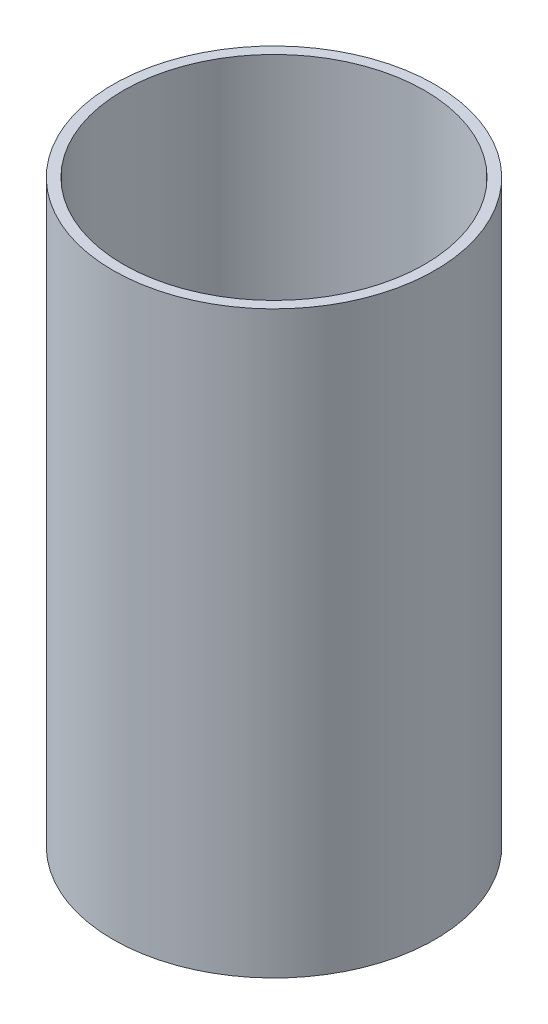
ISO-10303-21;
HEADER;
FILE_DESCRIPTION(('STEP AP214'),'2;1');
FILE_NAME('part.step','',(''),(''),'','','');
FILE_SCHEMA(('AUTOMOTIVE_DESIGN { 1 0 10303 214 1 1 1 1 }'));
ENDSEC;
DATA;
#1=APPLICATION_CONTEXT('core data for automotive mechanical design processes');
#2=APPLICATION_PROTOCOL_DEFINITION('international standard','automotive_design',2000,#1);
#3=PRODUCT_CONTEXT('',#1,'mechanical');
#4=PRODUCT('Part','Part','',(#3));
#5=PRODUCT_RELATED_PRODUCT_CATEGORY('part','',(#4));
#6=PRODUCT_DEFINITION_FORMATION('','',#4);
#7=PRODUCT_DEFINITION_CONTEXT('part definition',#1,'design');
#8=PRODUCT_DEFINITION('design','',#6,#7);
#9=PRODUCT_DEFINITION_SHAPE('','',#8);
#10=(LENGTH_UNIT() NAMED_UNIT(*) SI_UNIT(.MILLI.,.METRE.));
#11=(NAMED_UNIT(*) PLANE_ANGLE_UNIT() SI_UNIT($,.RADIAN.));
#12=(NAMED_UNIT(*) SI_UNIT($,.STERADIAN.) SOLID_ANGLE_UNIT());
#13=UNCERTAINTY_MEASURE_WITH_UNIT(LENGTH_MEASURE(1.E-05),#10,'distance_accuracy_value','');
#14=(GEOMETRIC_REPRESENTATION_CONTEXT(3) GLOBAL_UNCERTAINTY_ASSIGNED_CONTEXT((#13)) GLOBAL_UNIT_ASSIGNED_CONTEXT((#10,
#11,#12)) REPRESENTATION_CONTEXT('',''));
#15=CARTESIAN_POINT('',(0.,0.,0.));
#16=DIRECTION('',(0.,0.,1.));
#17=DIRECTION('',(1.,0.,0.));
#18=AXIS2_PLACEMENT_3D('',#15,#16,#17);
#19=CARTESIAN_POINT('',(0.,3.175,0.));
#20=DIRECTION('',(0.,1.,0.));
#21=DIRECTION('',(0.,0.,1.));
#22=AXIS2_PLACEMENT_3D('',#19,#20,#21);
#23=PLANE('',#22);
#24=CARTESIAN_POINT('',(0.,3.175,0.));
#25=DIRECTION('',(0.,-1.,0.));
#26=DIRECTION('',(0.,0.,-1.));
#27=AXIS2_PLACEMENT_3D('',#24,#25,#26);
#28=CIRCLE('',#27,46.228);
#29=CARTESIAN_POINT('',(0.,3.175,-46.228));
#30=VERTEX_POINT('',#29);
#31=EDGE_CURVE('E10',#30,#30,#28,.T.);
#32=ORIENTED_EDGE('',*,*,#31,.F.);
#33=EDGE_LOOP('',(#32));
#34=FACE_BOUND('',#33,.T.);
#35=ADVANCED_FACE('F41',(#34),#23,.T.);
#36=CARTESIAN_POINT('',(0.,-8.89,0.));
#37=DIRECTION('',(0.,-1.,0.));
#38=DIRECTION('',(0.,0.,-1.));
#39=AXIS2_PLACEMENT_3D('',#36,#37,#38);
#40=CYLINDRICAL_SURFACE('',#39,46.228);
#41=ORIENTED_EDGE('',*,*,#31,.T.);
#42=EDGE_LOOP('',(#41));
#43=FACE_BOUND('',#42,.T.);
#44=CARTESIAN_POINT('',(0.,177.8,0.));
#45=DIRECTION('',(0.,-1.,0.));
#46=DIRECTION('',(0.,0.,-1.));
#47=AXIS2_PLACEMENT_3D('',#44,#45,#46);
#48=CIRCLE('',#47,46.228);
#49=CARTESIAN_POINT('',(0.,177.8,-46.228));
#50=VERTEX_POINT('',#49);
#51=EDGE_CURVE('E48',#50,#50,#48,.T.);
#52=ORIENTED_EDGE('',*,*,#51,.F.);
#53=EDGE_LOOP('',(#52));
#54=FACE_BOUND('',#53,.T.);
#55=ADVANCED_FACE('F77',(#43,#54),#40,.F.);
#56=CARTESIAN_POINT('',(49.403,177.8,0.));
#57=DIRECTION('',(0.,1.,0.));
#58=DIRECTION('',(0.,0.,1.));
#59=AXIS2_PLACEMENT_3D('',#56,#57,#58);
#60=PLANE('',#59);
#61=ORIENTED_EDGE('',*,*,#51,.T.);
#62=EDGE_LOOP('',(#61));
#63=FACE_BOUND('',#62,.T.);
#64=CARTESIAN_POINT('',(0.,177.8,0.));
#65=DIRECTION('',(0.,-1.,0.));
#66=DIRECTION('',(0.,0.,-1.));
#67=AXIS2_PLACEMENT_3D('',#64,#65,#66);
#68=CIRCLE('',#67,49.403);
#69=CARTESIAN_POINT('',(0.,177.8,-49.403));
#70=VERTEX_POINT('',#69);
#71=EDGE_CURVE('E53',#70,#70,#68,.T.);
#72=ORIENTED_EDGE('',*,*,#71,.F.);
#73=EDGE_LOOP('',(#72));
#74=FACE_BOUND('',#73,.T.);
#75=ADVANCED_FACE('F69',(#63,#74),#60,.T.);
#76=CARTESIAN_POINT('',(0.,-8.89,0.));
#77=DIRECTION('',(0.,-1.,0.));
#78=DIRECTION('',(0.,0.,-1.));
#79=AXIS2_PLACEMENT_3D('',#76,#77,#78);
#80=CYLINDRICAL_SURFACE('',#79,49.403);
#81=ORIENTED_EDGE('',*,*,#71,.T.);
#82=EDGE_LOOP('',(#81));
#83=FACE_BOUND('',#82,.T.);
#84=CARTESIAN_POINT('',(0.,0.,0.));
#85=DIRECTION('',(0.,-1.,0.));
#86=DIRECTION('',(0.,0.,-1.));
#87=AXIS2_PLACEMENT_3D('',#84,#85,#86);
#88=CIRCLE('',#87,49.403);
#89=CARTESIAN_POINT('',(0.,0.,-49.403));
#90=VERTEX_POINT('',#89);
#91=EDGE_CURVE('E58',#90,#90,#88,.T.);
#92=ORIENTED_EDGE('',*,*,#91,.F.);
#93=EDGE_LOOP('',(#92));
#94=FACE_BOUND('',#93,.T.);
#95=ADVANCED_FACE('F67',(#83,#94),#80,.T.);
#96=CARTESIAN_POINT('',(0.,0.,0.));
#97=DIRECTION('',(0.,-1.,0.));
#98=DIRECTION('',(0.,0.,-1.));
#99=AXIS2_PLACEMENT_3D('',#96,#97,#98);
#100=PLANE('',#99);
#101=ORIENTED_EDGE('',*,*,#91,.T.);
#102=EDGE_LOOP('',(#101));
#103=FACE_BOUND('',#102,.T.);
#104=ADVANCED_FACE('F65',(#103),#100,.T.);
#105=CLOSED_SHELL('',(#35,#55,#75,#95,#104));
#106=MANIFOLD_SOLID_BREP('B2',#105);
#107=ADVANCED_BREP_SHAPE_REPRESENTATION('',(#18,#106),#14);
#108=SHAPE_DEFINITION_REPRESENTATION(#9,#107);
ENDSEC;
END-ISO-10303-21;
